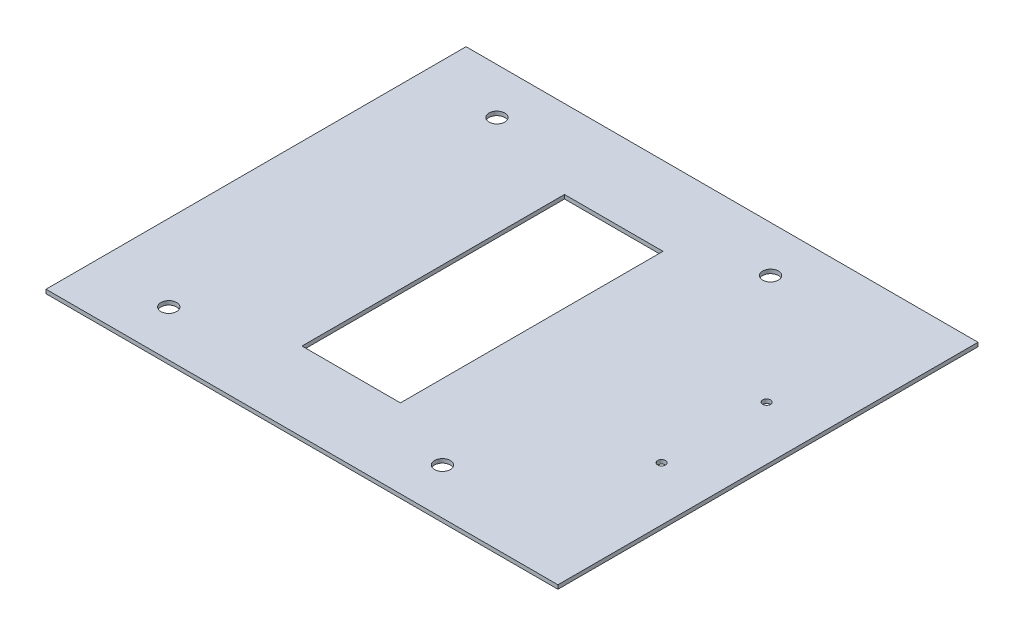
ISO-10303-21;
HEADER;
FILE_DESCRIPTION(('STEP AP214'),'2;1');
FILE_NAME('part.step','',(''),(''),'','','');
FILE_SCHEMA(('AUTOMOTIVE_DESIGN { 1 0 10303 214 1 1 1 1 }'));
ENDSEC;
DATA;
#1=APPLICATION_CONTEXT('core data for automotive mechanical design processes');
#2=APPLICATION_PROTOCOL_DEFINITION('international standard','automotive_design',2000,#1);
#3=PRODUCT_CONTEXT('',#1,'mechanical');
#4=PRODUCT('Part','Part','',(#3));
#5=PRODUCT_RELATED_PRODUCT_CATEGORY('part','',(#4));
#6=PRODUCT_DEFINITION_FORMATION('','',#4);
#7=PRODUCT_DEFINITION_CONTEXT('part definition',#1,'design');
#8=PRODUCT_DEFINITION('design','',#6,#7);
#9=PRODUCT_DEFINITION_SHAPE('','',#8);
#10=(LENGTH_UNIT() NAMED_UNIT(*) SI_UNIT(.MILLI.,.METRE.));
#11=(NAMED_UNIT(*) PLANE_ANGLE_UNIT() SI_UNIT($,.RADIAN.));
#12=(NAMED_UNIT(*) SI_UNIT($,.STERADIAN.) SOLID_ANGLE_UNIT());
#13=UNCERTAINTY_MEASURE_WITH_UNIT(LENGTH_MEASURE(1.E-05),#10,'distance_accuracy_value','');
#14=(GEOMETRIC_REPRESENTATION_CONTEXT(3) GLOBAL_UNCERTAINTY_ASSIGNED_CONTEXT((#13)) GLOBAL_UNIT_ASSIGNED_CONTEXT((#10,
#11,#12)) REPRESENTATION_CONTEXT('',''));
#15=CARTESIAN_POINT('',(0.,0.,0.));
#16=DIRECTION('',(0.,0.,1.));
#17=DIRECTION('',(1.,0.,0.));
#18=AXIS2_PLACEMENT_3D('',#15,#16,#17);
#19=CARTESIAN_POINT('',(0.,3.,-320.));
#20=DIRECTION('',(0.,0.,1.));
#21=DIRECTION('',(1.,0.,0.));
#22=AXIS2_PLACEMENT_3D('',#19,#20,#21);
#23=PLANE('',#22);
#24=DIRECTION('',(-1.,0.,0.));
#25=VECTOR('',#24,1.);
#26=CARTESIAN_POINT('',(0.,0.,-320.));
#27=LINE('',#26,#25);
#28=CARTESIAN_POINT('',(390.,0.,-320.));
#29=VERTEX_POINT('',#28);
#30=CARTESIAN_POINT('',(0.,0.,-320.));
#31=VERTEX_POINT('',#30);
#32=EDGE_CURVE('E125',#29,#31,#27,.T.);
#33=ORIENTED_EDGE('',*,*,#32,.T.);
#34=DIRECTION('',(0.,-1.,0.));
#35=VECTOR('',#34,1.);
#36=CARTESIAN_POINT('',(0.,3.,-320.));
#37=LINE('',#36,#35);
#38=CARTESIAN_POINT('',(0.,3.,-320.));
#39=VERTEX_POINT('',#38);
#40=EDGE_CURVE('E154',#39,#31,#37,.T.);
#41=ORIENTED_EDGE('',*,*,#40,.F.);
#42=DIRECTION('',(-1.,0.,0.));
#43=VECTOR('',#42,1.);
#44=CARTESIAN_POINT('',(0.,3.,-320.));
#45=LINE('',#44,#43);
#46=CARTESIAN_POINT('',(390.,3.,-320.));
#47=VERTEX_POINT('',#46);
#48=EDGE_CURVE('E136',#47,#39,#45,.T.);
#49=ORIENTED_EDGE('',*,*,#48,.F.);
#50=DIRECTION('',(0.,-1.,0.));
#51=VECTOR('',#50,1.);
#52=CARTESIAN_POINT('',(390.,3.,-320.));
#53=LINE('',#52,#51);
#54=EDGE_CURVE('E145',#47,#29,#53,.T.);
#55=ORIENTED_EDGE('',*,*,#54,.T.);
#56=EDGE_LOOP('',(#33,#41,#49,#55));
#57=FACE_BOUND('',#56,.T.);
#58=ADVANCED_FACE('F33',(#57),#23,.F.);
#59=CARTESIAN_POINT('',(0.,3.,0.));
#60=DIRECTION('',(1.,0.,0.));
#61=DIRECTION('',(0.,0.,-1.));
#62=AXIS2_PLACEMENT_3D('',#59,#60,#61);
#63=PLANE('',#62);
#64=DIRECTION('',(0.,0.,1.));
#65=VECTOR('',#64,1.);
#66=CARTESIAN_POINT('',(0.,0.,0.));
#67=LINE('',#66,#65);
#68=CARTESIAN_POINT('',(0.,0.,0.));
#69=VERTEX_POINT('',#68);
#70=EDGE_CURVE('E130',#31,#69,#67,.T.);
#71=ORIENTED_EDGE('',*,*,#70,.T.);
#72=DIRECTION('',(0.,-1.,0.));
#73=VECTOR('',#72,1.);
#74=CARTESIAN_POINT('',(0.,3.,0.));
#75=LINE('',#74,#73);
#76=CARTESIAN_POINT('',(0.,3.,0.));
#77=VERTEX_POINT('',#76);
#78=EDGE_CURVE('E151',#77,#69,#75,.T.);
#79=ORIENTED_EDGE('',*,*,#78,.F.);
#80=DIRECTION('',(0.,0.,1.));
#81=VECTOR('',#80,1.);
#82=CARTESIAN_POINT('',(0.,3.,0.));
#83=LINE('',#82,#81);
#84=EDGE_CURVE('E139',#39,#77,#83,.T.);
#85=ORIENTED_EDGE('',*,*,#84,.F.);
#86=ORIENTED_EDGE('',*,*,#40,.T.);
#87=EDGE_LOOP('',(#71,#79,#85,#86));
#88=FACE_BOUND('',#87,.T.);
#89=ADVANCED_FACE('F220',(#88),#63,.F.);
#90=CARTESIAN_POINT('',(0.,3.,0.));
#91=DIRECTION('',(0.,0.,-1.));
#92=DIRECTION('',(-1.,0.,0.));
#93=AXIS2_PLACEMENT_3D('',#90,#91,#92);
#94=PLANE('',#93);
#95=DIRECTION('',(1.,0.,0.));
#96=VECTOR('',#95,1.);
#97=CARTESIAN_POINT('',(0.,0.,0.));
#98=LINE('',#97,#96);
#99=CARTESIAN_POINT('',(390.,0.,0.));
#100=VERTEX_POINT('',#99);
#101=EDGE_CURVE('E132',#69,#100,#98,.T.);
#102=ORIENTED_EDGE('',*,*,#101,.T.);
#103=DIRECTION('',(0.,-1.,0.));
#104=VECTOR('',#103,1.);
#105=CARTESIAN_POINT('',(390.,3.,0.));
#106=LINE('',#105,#104);
#107=CARTESIAN_POINT('',(390.,3.,0.));
#108=VERTEX_POINT('',#107);
#109=EDGE_CURVE('E148',#108,#100,#106,.T.);
#110=ORIENTED_EDGE('',*,*,#109,.F.);
#111=DIRECTION('',(1.,0.,0.));
#112=VECTOR('',#111,1.);
#113=CARTESIAN_POINT('',(0.,3.,0.));
#114=LINE('',#113,#112);
#115=EDGE_CURVE('E141',#77,#108,#114,.T.);
#116=ORIENTED_EDGE('',*,*,#115,.F.);
#117=ORIENTED_EDGE('',*,*,#78,.T.);
#118=EDGE_LOOP('',(#102,#110,#116,#117));
#119=FACE_BOUND('',#118,.T.);
#120=ADVANCED_FACE('F214',(#119),#94,.F.);
#121=CARTESIAN_POINT('',(390.,3.,0.));
#122=DIRECTION('',(-1.,0.,0.));
#123=DIRECTION('',(0.,0.,1.));
#124=AXIS2_PLACEMENT_3D('',#121,#122,#123);
#125=PLANE('',#124);
#126=DIRECTION('',(0.,0.,-1.));
#127=VECTOR('',#126,1.);
#128=CARTESIAN_POINT('',(390.,0.,0.));
#129=LINE('',#128,#127);
#130=EDGE_CURVE('E134',#100,#29,#129,.T.);
#131=ORIENTED_EDGE('',*,*,#130,.T.);
#132=ORIENTED_EDGE('',*,*,#54,.F.);
#133=DIRECTION('',(0.,0.,-1.));
#134=VECTOR('',#133,1.);
#135=CARTESIAN_POINT('',(390.,3.,0.));
#136=LINE('',#135,#134);
#137=EDGE_CURVE('E143',#108,#47,#136,.T.);
#138=ORIENTED_EDGE('',*,*,#137,.F.);
#139=ORIENTED_EDGE('',*,*,#109,.T.);
#140=EDGE_LOOP('',(#131,#132,#138,#139));
#141=FACE_BOUND('',#140,.T.);
#142=ADVANCED_FACE('F204',(#141),#125,.F.);
#143=CARTESIAN_POINT('',(390.,3.,-320.));
#144=DIRECTION('',(0.,1.,0.));
#145=DIRECTION('',(0.,0.,1.));
#146=AXIS2_PLACEMENT_3D('',#143,#144,#145);
#147=PLANE('',#146);
#148=CARTESIAN_POINT('',(349.,3.,-120.));
#149=DIRECTION('',(0.,1.,0.));
#150=DIRECTION('',(0.,0.,1.));
#151=AXIS2_PLACEMENT_3D('',#148,#149,#150);
#152=CIRCLE('',#151,2.99999999999999);
#153=CARTESIAN_POINT('',(349.,3.,-117.));
#154=VERTEX_POINT('',#153);
#155=EDGE_CURVE('E189',#154,#154,#152,.T.);
#156=ORIENTED_EDGE('',*,*,#155,.F.);
#157=EDGE_LOOP('',(#156));
#158=FACE_BOUND('',#157,.T.);
#159=CARTESIAN_POINT('',(349.,3.,-200.));
#160=DIRECTION('',(0.,1.,0.));
#161=DIRECTION('',(0.,0.,1.));
#162=AXIS2_PLACEMENT_3D('',#159,#160,#161);
#163=CIRCLE('',#162,2.99999999999999);
#164=CARTESIAN_POINT('',(349.,3.,-197.));
#165=VERTEX_POINT('',#164);
#166=EDGE_CURVE('E179',#165,#165,#163,.T.);
#167=ORIENTED_EDGE('',*,*,#166,.F.);
#168=EDGE_LOOP('',(#167));
#169=FACE_BOUND('',#168,.T.);
#170=CARTESIAN_POINT('',(58.4999999999999,3.,-34.9999999999999));
#171=DIRECTION('',(0.,1.,0.));
#172=DIRECTION('',(0.,0.,1.));
#173=AXIS2_PLACEMENT_3D('',#170,#171,#172);
#174=CIRCLE('',#173,6.00000000000001);
#175=CARTESIAN_POINT('',(58.4999999999999,3.,-28.9999999999999));
#176=VERTEX_POINT('',#175);
#177=EDGE_CURVE('E176',#176,#176,#174,.T.);
#178=ORIENTED_EDGE('',*,*,#177,.F.);
#179=EDGE_LOOP('',(#178));
#180=FACE_BOUND('',#179,.T.);
#181=CARTESIAN_POINT('',(267.,3.,-34.9999999999999));
#182=DIRECTION('',(0.,1.,0.));
#183=DIRECTION('',(0.,0.,1.));
#184=AXIS2_PLACEMENT_3D('',#181,#182,#183);
#185=CIRCLE('',#184,5.99999999999999);
#186=CARTESIAN_POINT('',(267.,3.,-28.9999999999999));
#187=VERTEX_POINT('',#186);
#188=EDGE_CURVE('E173',#187,#187,#185,.T.);
#189=ORIENTED_EDGE('',*,*,#188,.F.);
#190=EDGE_LOOP('',(#189));
#191=FACE_BOUND('',#190,.T.);
#192=CARTESIAN_POINT('',(58.4999999999999,3.,-285.));
#193=DIRECTION('',(0.,1.,0.));
#194=DIRECTION('',(0.,0.,1.));
#195=AXIS2_PLACEMENT_3D('',#192,#193,#194);
#196=CIRCLE('',#195,6.00000000000001);
#197=CARTESIAN_POINT('',(58.4999999999999,3.,-279.));
#198=VERTEX_POINT('',#197);
#199=EDGE_CURVE('E169',#198,#198,#196,.T.);
#200=ORIENTED_EDGE('',*,*,#199,.F.);
#201=EDGE_LOOP('',(#200));
#202=FACE_BOUND('',#201,.T.);
#203=CARTESIAN_POINT('',(267.,3.,-285.));
#204=DIRECTION('',(0.,1.,0.));
#205=DIRECTION('',(0.,0.,1.));
#206=AXIS2_PLACEMENT_3D('',#203,#204,#205);
#207=CIRCLE('',#206,5.99999999999999);
#208=CARTESIAN_POINT('',(267.,3.,-279.));
#209=VERTEX_POINT('',#208);
#210=EDGE_CURVE('E165',#209,#209,#207,.T.);
#211=ORIENTED_EDGE('',*,*,#210,.F.);
#212=EDGE_LOOP('',(#211));
#213=FACE_BOUND('',#212,.T.);
#214=DIRECTION('',(0.,0.,1.));
#215=VECTOR('',#214,1.);
#216=CARTESIAN_POINT('',(135.,3.,-59.9999999999999));
#217=LINE('',#216,#215);
#218=CARTESIAN_POINT('',(135.,3.,-260.));
#219=VERTEX_POINT('',#218);
#220=CARTESIAN_POINT('',(135.,3.,-59.9999999999999));
#221=VERTEX_POINT('',#220);
#222=EDGE_CURVE('E49',#219,#221,#217,.T.);
#223=ORIENTED_EDGE('',*,*,#222,.F.);
#224=DIRECTION('',(-1.,0.,0.));
#225=VECTOR('',#224,1.);
#226=CARTESIAN_POINT('',(135.,3.,-260.));
#227=LINE('',#226,#225);
#228=CARTESIAN_POINT('',(210.,3.,-260.));
#229=VERTEX_POINT('',#228);
#230=EDGE_CURVE('E118',#229,#219,#227,.T.);
#231=ORIENTED_EDGE('',*,*,#230,.F.);
#232=DIRECTION('',(0.,0.,-1.));
#233=VECTOR('',#232,1.);
#234=CARTESIAN_POINT('',(210.,3.,-59.9999999999999));
#235=LINE('',#234,#233);
#236=CARTESIAN_POINT('',(210.,3.,-59.9999999999999));
#237=VERTEX_POINT('',#236);
#238=EDGE_CURVE('E102',#237,#229,#235,.T.);
#239=ORIENTED_EDGE('',*,*,#238,.F.);
#240=DIRECTION('',(1.,0.,0.));
#241=VECTOR('',#240,1.);
#242=CARTESIAN_POINT('',(135.,3.,-59.9999999999999));
#243=LINE('',#242,#241);
#244=EDGE_CURVE('E111',#221,#237,#243,.T.);
#245=ORIENTED_EDGE('',*,*,#244,.F.);
#246=EDGE_LOOP('',(#223,#231,#239,#245));
#247=FACE_BOUND('',#246,.T.);
#248=ORIENTED_EDGE('',*,*,#48,.T.);
#249=ORIENTED_EDGE('',*,*,#84,.T.);
#250=ORIENTED_EDGE('',*,*,#115,.T.);
#251=ORIENTED_EDGE('',*,*,#137,.T.);
#252=EDGE_LOOP('',(#248,#249,#250,#251));
#253=FACE_BOUND('',#252,.T.);
#254=ADVANCED_FACE('F115',(#158,#169,#180,#191,#202,#213,#247,#253),#147,.T.);
#255=CARTESIAN_POINT('',(390.,0.,-320.));
#256=DIRECTION('',(0.,1.,0.));
#257=DIRECTION('',(0.,0.,1.));
#258=AXIS2_PLACEMENT_3D('',#255,#256,#257);
#259=PLANE('',#258);
#260=CARTESIAN_POINT('',(349.,0.,-120.));
#261=DIRECTION('',(0.,1.,0.));
#262=DIRECTION('',(0.,0.,1.));
#263=AXIS2_PLACEMENT_3D('',#260,#261,#262);
#264=CIRCLE('',#263,2.99999999999999);
#265=CARTESIAN_POINT('',(349.,0.,-117.));
#266=VERTEX_POINT('',#265);
#267=EDGE_CURVE('E36',#266,#266,#264,.T.);
#268=ORIENTED_EDGE('',*,*,#267,.T.);
#269=EDGE_LOOP('',(#268));
#270=FACE_BOUND('',#269,.T.);
#271=CARTESIAN_POINT('',(349.,0.,-200.));
#272=DIRECTION('',(0.,1.,0.));
#273=DIRECTION('',(0.,0.,1.));
#274=AXIS2_PLACEMENT_3D('',#271,#272,#273);
#275=CIRCLE('',#274,2.99999999999999);
#276=CARTESIAN_POINT('',(349.,0.,-197.));
#277=VERTEX_POINT('',#276);
#278=EDGE_CURVE('E177',#277,#277,#275,.T.);
#279=ORIENTED_EDGE('',*,*,#278,.T.);
#280=EDGE_LOOP('',(#279));
#281=FACE_BOUND('',#280,.T.);
#282=CARTESIAN_POINT('',(58.4999999999999,0.,-34.9999999999999));
#283=DIRECTION('',(0.,1.,0.));
#284=DIRECTION('',(0.,0.,1.));
#285=AXIS2_PLACEMENT_3D('',#282,#283,#284);
#286=CIRCLE('',#285,6.00000000000001);
#287=CARTESIAN_POINT('',(58.4999999999999,0.,-28.9999999999999));
#288=VERTEX_POINT('',#287);
#289=EDGE_CURVE('E174',#288,#288,#286,.T.);
#290=ORIENTED_EDGE('',*,*,#289,.T.);
#291=EDGE_LOOP('',(#290));
#292=FACE_BOUND('',#291,.T.);
#293=CARTESIAN_POINT('',(267.,0.,-34.9999999999999));
#294=DIRECTION('',(0.,1.,0.));
#295=DIRECTION('',(0.,0.,1.));
#296=AXIS2_PLACEMENT_3D('',#293,#294,#295);
#297=CIRCLE('',#296,5.99999999999999);
#298=CARTESIAN_POINT('',(267.,0.,-28.9999999999999));
#299=VERTEX_POINT('',#298);
#300=EDGE_CURVE('E170',#299,#299,#297,.T.);
#301=ORIENTED_EDGE('',*,*,#300,.T.);
#302=EDGE_LOOP('',(#301));
#303=FACE_BOUND('',#302,.T.);
#304=CARTESIAN_POINT('',(58.4999999999999,0.,-285.));
#305=DIRECTION('',(0.,1.,0.));
#306=DIRECTION('',(0.,0.,1.));
#307=AXIS2_PLACEMENT_3D('',#304,#305,#306);
#308=CIRCLE('',#307,6.00000000000001);
#309=CARTESIAN_POINT('',(58.4999999999999,0.,-279.));
#310=VERTEX_POINT('',#309);
#311=EDGE_CURVE('E166',#310,#310,#308,.T.);
#312=ORIENTED_EDGE('',*,*,#311,.T.);
#313=EDGE_LOOP('',(#312));
#314=FACE_BOUND('',#313,.T.);
#315=CARTESIAN_POINT('',(267.,0.,-285.));
#316=DIRECTION('',(0.,1.,0.));
#317=DIRECTION('',(0.,0.,1.));
#318=AXIS2_PLACEMENT_3D('',#315,#316,#317);
#319=CIRCLE('',#318,5.99999999999999);
#320=CARTESIAN_POINT('',(267.,0.,-279.));
#321=VERTEX_POINT('',#320);
#322=EDGE_CURVE('E162',#321,#321,#319,.T.);
#323=ORIENTED_EDGE('',*,*,#322,.T.);
#324=EDGE_LOOP('',(#323));
#325=FACE_BOUND('',#324,.T.);
#326=DIRECTION('',(-1.,0.,0.));
#327=VECTOR('',#326,1.);
#328=CARTESIAN_POINT('',(390.,0.,-260.));
#329=LINE('',#328,#327);
#330=CARTESIAN_POINT('',(210.,0.,-260.));
#331=VERTEX_POINT('',#330);
#332=CARTESIAN_POINT('',(135.,0.,-260.));
#333=VERTEX_POINT('',#332);
#334=EDGE_CURVE('E41',#331,#333,#329,.T.);
#335=ORIENTED_EDGE('',*,*,#334,.T.);
#336=DIRECTION('',(0.,0.,1.));
#337=VECTOR('',#336,1.);
#338=CARTESIAN_POINT('',(135.,0.,-320.));
#339=LINE('',#338,#337);
#340=CARTESIAN_POINT('',(135.,0.,-59.9999999999999));
#341=VERTEX_POINT('',#340);
#342=EDGE_CURVE('E11',#333,#341,#339,.T.);
#343=ORIENTED_EDGE('',*,*,#342,.T.);
#344=DIRECTION('',(1.,0.,0.));
#345=VECTOR('',#344,1.);
#346=CARTESIAN_POINT('',(390.,0.,-59.9999999999999));
#347=LINE('',#346,#345);
#348=CARTESIAN_POINT('',(210.,0.,-59.9999999999999));
#349=VERTEX_POINT('',#348);
#350=EDGE_CURVE('E157',#341,#349,#347,.T.);
#351=ORIENTED_EDGE('',*,*,#350,.T.);
#352=DIRECTION('',(0.,0.,-1.));
#353=VECTOR('',#352,1.);
#354=CARTESIAN_POINT('',(210.,0.,-320.));
#355=LINE('',#354,#353);
#356=EDGE_CURVE('E105',#349,#331,#355,.T.);
#357=ORIENTED_EDGE('',*,*,#356,.T.);
#358=EDGE_LOOP('',(#335,#343,#351,#357));
#359=FACE_BOUND('',#358,.T.);
#360=ORIENTED_EDGE('',*,*,#32,.F.);
#361=ORIENTED_EDGE('',*,*,#130,.F.);
#362=ORIENTED_EDGE('',*,*,#101,.F.);
#363=ORIENTED_EDGE('',*,*,#70,.F.);
#364=EDGE_LOOP('',(#360,#361,#362,#363));
#365=FACE_BOUND('',#364,.T.);
#366=ADVANCED_FACE('F203',(#270,#281,#292,#303,#314,#325,#359,#365),#259,.F.);
#367=CARTESIAN_POINT('',(135.,-1.,-59.9999999999999));
#368=DIRECTION('',(-1.,0.,0.));
#369=DIRECTION('',(0.,0.,1.));
#370=AXIS2_PLACEMENT_3D('',#367,#368,#369);
#371=PLANE('',#370);
#372=DIRECTION('',(0.,1.,0.));
#373=VECTOR('',#372,1.);
#374=CARTESIAN_POINT('',(135.,-1.,-260.));
#375=LINE('',#374,#373);
#376=EDGE_CURVE('E123',#333,#219,#375,.T.);
#377=ORIENTED_EDGE('',*,*,#376,.T.);
#378=ORIENTED_EDGE('',*,*,#222,.T.);
#379=DIRECTION('',(0.,1.,0.));
#380=VECTOR('',#379,1.);
#381=CARTESIAN_POINT('',(135.,-1.,-59.9999999999999));
#382=LINE('',#381,#380);
#383=EDGE_CURVE('E108',#341,#221,#382,.T.);
#384=ORIENTED_EDGE('',*,*,#383,.F.);
#385=ORIENTED_EDGE('',*,*,#342,.F.);
#386=EDGE_LOOP('',(#377,#378,#384,#385));
#387=FACE_BOUND('',#386,.T.);
#388=ADVANCED_FACE('F211',(#387),#371,.F.);
#389=CARTESIAN_POINT('',(135.,-1.,-260.));
#390=DIRECTION('',(0.,0.,-1.));
#391=DIRECTION('',(-1.,0.,0.));
#392=AXIS2_PLACEMENT_3D('',#389,#390,#391);
#393=PLANE('',#392);
#394=DIRECTION('',(0.,1.,0.));
#395=VECTOR('',#394,1.);
#396=CARTESIAN_POINT('',(210.,-1.,-260.));
#397=LINE('',#396,#395);
#398=EDGE_CURVE('E107',#331,#229,#397,.T.);
#399=ORIENTED_EDGE('',*,*,#398,.T.);
#400=ORIENTED_EDGE('',*,*,#230,.T.);
#401=ORIENTED_EDGE('',*,*,#376,.F.);
#402=ORIENTED_EDGE('',*,*,#334,.F.);
#403=EDGE_LOOP('',(#399,#400,#401,#402));
#404=FACE_BOUND('',#403,.T.);
#405=ADVANCED_FACE('F268',(#404),#393,.F.);
#406=CARTESIAN_POINT('',(210.,-1.,-59.9999999999999));
#407=DIRECTION('',(1.,0.,0.));
#408=DIRECTION('',(0.,0.,-1.));
#409=AXIS2_PLACEMENT_3D('',#406,#407,#408);
#410=PLANE('',#409);
#411=DIRECTION('',(0.,1.,0.));
#412=VECTOR('',#411,1.);
#413=CARTESIAN_POINT('',(210.,-1.,-59.9999999999999));
#414=LINE('',#413,#412);
#415=EDGE_CURVE('E57',#349,#237,#414,.T.);
#416=ORIENTED_EDGE('',*,*,#415,.T.);
#417=ORIENTED_EDGE('',*,*,#238,.T.);
#418=ORIENTED_EDGE('',*,*,#398,.F.);
#419=ORIENTED_EDGE('',*,*,#356,.F.);
#420=EDGE_LOOP('',(#416,#417,#418,#419));
#421=FACE_BOUND('',#420,.T.);
#422=ADVANCED_FACE('F99',(#421),#410,.F.);
#423=CARTESIAN_POINT('',(135.,-1.,-59.9999999999999));
#424=DIRECTION('',(0.,0.,1.));
#425=DIRECTION('',(1.,0.,0.));
#426=AXIS2_PLACEMENT_3D('',#423,#424,#425);
#427=PLANE('',#426);
#428=ORIENTED_EDGE('',*,*,#383,.T.);
#429=ORIENTED_EDGE('',*,*,#244,.T.);
#430=ORIENTED_EDGE('',*,*,#415,.F.);
#431=ORIENTED_EDGE('',*,*,#350,.F.);
#432=EDGE_LOOP('',(#428,#429,#430,#431));
#433=FACE_BOUND('',#432,.T.);
#434=ADVANCED_FACE('F112',(#433),#427,.F.);
#435=CARTESIAN_POINT('',(267.,-1.,-285.));
#436=DIRECTION('',(0.,1.,0.));
#437=DIRECTION('',(0.,0.,1.));
#438=AXIS2_PLACEMENT_3D('',#435,#436,#437);
#439=CYLINDRICAL_SURFACE('',#438,5.99999999999999);
#440=ORIENTED_EDGE('',*,*,#210,.T.);
#441=EDGE_LOOP('',(#440));
#442=FACE_BOUND('',#441,.T.);
#443=ORIENTED_EDGE('',*,*,#322,.F.);
#444=EDGE_LOOP('',(#443));
#445=FACE_BOUND('',#444,.T.);
#446=ADVANCED_FACE('F199',(#442,#445),#439,.F.);
#447=CARTESIAN_POINT('',(58.4999999999999,-1.,-285.));
#448=DIRECTION('',(0.,1.,0.));
#449=DIRECTION('',(0.,0.,1.));
#450=AXIS2_PLACEMENT_3D('',#447,#448,#449);
#451=CYLINDRICAL_SURFACE('',#450,6.00000000000001);
#452=ORIENTED_EDGE('',*,*,#199,.T.);
#453=EDGE_LOOP('',(#452));
#454=FACE_BOUND('',#453,.T.);
#455=ORIENTED_EDGE('',*,*,#311,.F.);
#456=EDGE_LOOP('',(#455));
#457=FACE_BOUND('',#456,.T.);
#458=ADVANCED_FACE('F302',(#454,#457),#451,.F.);
#459=CARTESIAN_POINT('',(267.,-1.,-34.9999999999999));
#460=DIRECTION('',(0.,1.,0.));
#461=DIRECTION('',(0.,0.,1.));
#462=AXIS2_PLACEMENT_3D('',#459,#460,#461);
#463=CYLINDRICAL_SURFACE('',#462,5.99999999999999);
#464=ORIENTED_EDGE('',*,*,#188,.T.);
#465=EDGE_LOOP('',(#464));
#466=FACE_BOUND('',#465,.T.);
#467=ORIENTED_EDGE('',*,*,#300,.F.);
#468=EDGE_LOOP('',(#467));
#469=FACE_BOUND('',#468,.T.);
#470=ADVANCED_FACE('F311',(#466,#469),#463,.F.);
#471=CARTESIAN_POINT('',(58.4999999999999,-1.,-34.9999999999999));
#472=DIRECTION('',(0.,1.,0.));
#473=DIRECTION('',(0.,0.,1.));
#474=AXIS2_PLACEMENT_3D('',#471,#472,#473);
#475=CYLINDRICAL_SURFACE('',#474,6.00000000000001);
#476=ORIENTED_EDGE('',*,*,#177,.T.);
#477=EDGE_LOOP('',(#476));
#478=FACE_BOUND('',#477,.T.);
#479=ORIENTED_EDGE('',*,*,#289,.F.);
#480=EDGE_LOOP('',(#479));
#481=FACE_BOUND('',#480,.T.);
#482=ADVANCED_FACE('F321',(#478,#481),#475,.F.);
#483=CARTESIAN_POINT('',(349.,-7.,-200.));
#484=DIRECTION('',(0.,1.,0.));
#485=DIRECTION('',(0.,0.,1.));
#486=AXIS2_PLACEMENT_3D('',#483,#484,#485);
#487=CYLINDRICAL_SURFACE('',#486,2.99999999999999);
#488=ORIENTED_EDGE('',*,*,#166,.T.);
#489=EDGE_LOOP('',(#488));
#490=FACE_BOUND('',#489,.T.);
#491=ORIENTED_EDGE('',*,*,#278,.F.);
#492=EDGE_LOOP('',(#491));
#493=FACE_BOUND('',#492,.T.);
#494=ADVANCED_FACE('F331',(#490,#493),#487,.F.);
#495=CARTESIAN_POINT('',(349.,-7.,-120.));
#496=DIRECTION('',(0.,1.,0.));
#497=DIRECTION('',(0.,0.,1.));
#498=AXIS2_PLACEMENT_3D('',#495,#496,#497);
#499=CYLINDRICAL_SURFACE('',#498,2.99999999999999);
#500=ORIENTED_EDGE('',*,*,#155,.T.);
#501=EDGE_LOOP('',(#500));
#502=FACE_BOUND('',#501,.T.);
#503=ORIENTED_EDGE('',*,*,#267,.F.);
#504=EDGE_LOOP('',(#503));
#505=FACE_BOUND('',#504,.T.);
#506=ADVANCED_FACE('F341',(#502,#505),#499,.F.);
#507=CLOSED_SHELL('',(#58,#89,#120,#142,#254,#366,#388,#405,#422,#434,#446,#458,#470,#482,#494,#506));
#508=MANIFOLD_SOLID_BREP('B2',#507);
#509=ADVANCED_BREP_SHAPE_REPRESENTATION('',(#18,#508),#14);
#510=SHAPE_DEFINITION_REPRESENTATION(#9,#509);
ENDSEC;
END-ISO-10303-21;
